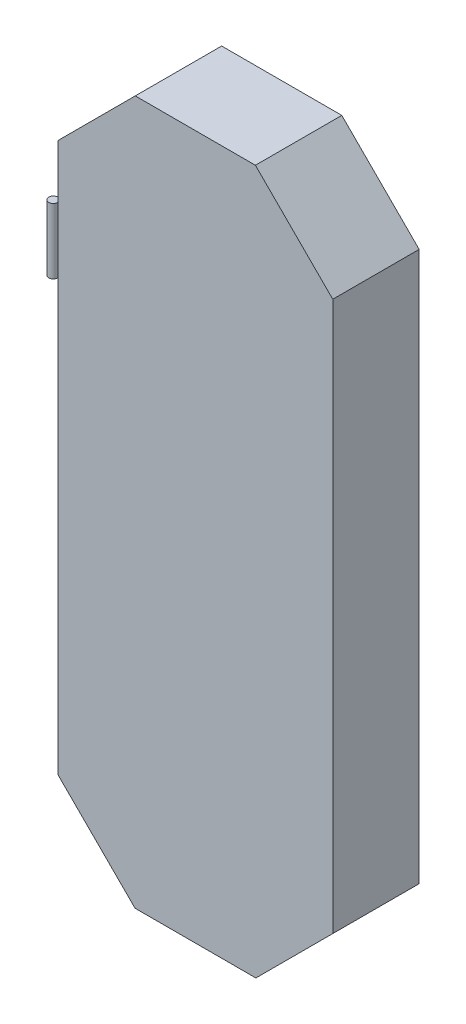
ISO-10303-21;
HEADER;
FILE_DESCRIPTION(('STEP AP214'),'2;1');
FILE_NAME('part.step','',(''),(''),'','','');
FILE_SCHEMA(('AUTOMOTIVE_DESIGN { 1 0 10303 214 1 1 1 1 }'));
ENDSEC;
DATA;
#1=APPLICATION_CONTEXT('core data for automotive mechanical design processes');
#2=APPLICATION_PROTOCOL_DEFINITION('international standard','automotive_design',2000,#1);
#3=PRODUCT_CONTEXT('',#1,'mechanical');
#4=PRODUCT('Part','Part','',(#3));
#5=PRODUCT_RELATED_PRODUCT_CATEGORY('part','',(#4));
#6=PRODUCT_DEFINITION_FORMATION('','',#4);
#7=PRODUCT_DEFINITION_CONTEXT('part definition',#1,'design');
#8=PRODUCT_DEFINITION('design','',#6,#7);
#9=PRODUCT_DEFINITION_SHAPE('','',#8);
#10=(LENGTH_UNIT() NAMED_UNIT(*) SI_UNIT(.MILLI.,.METRE.));
#11=(NAMED_UNIT(*) PLANE_ANGLE_UNIT() SI_UNIT($,.RADIAN.));
#12=(NAMED_UNIT(*) SI_UNIT($,.STERADIAN.) SOLID_ANGLE_UNIT());
#13=UNCERTAINTY_MEASURE_WITH_UNIT(LENGTH_MEASURE(1.E-05),#10,'distance_accuracy_value','');
#14=(GEOMETRIC_REPRESENTATION_CONTEXT(3) GLOBAL_UNCERTAINTY_ASSIGNED_CONTEXT((#13)) GLOBAL_UNIT_ASSIGNED_CONTEXT((#10,
#11,#12)) REPRESENTATION_CONTEXT('',''));
#15=CARTESIAN_POINT('',(0.,0.,0.));
#16=DIRECTION('',(0.,0.,1.));
#17=DIRECTION('',(1.,0.,0.));
#18=AXIS2_PLACEMENT_3D('',#15,#16,#17);
#19=CARTESIAN_POINT('',(-108.417078441272,540.825947063664,66.));
#20=DIRECTION('',(0.,-1.,0.));
#21=DIRECTION('',(1.,0.,0.));
#22=AXIS2_PLACEMENT_3D('',#19,#20,#21);
#23=CYLINDRICAL_SURFACE('',#22,3.50000000000001);
#24=CARTESIAN_POINT('',(-108.417078441272,540.825947063664,66.));
#25=DIRECTION('',(0.,1.,0.));
#26=DIRECTION('',(-1.,0.,0.));
#27=AXIS2_PLACEMENT_3D('',#24,#25,#26);
#28=CIRCLE('',#27,3.50000000000001);
#29=CARTESIAN_POINT('',(-111.917078441272,540.825947063664,66.));
#30=VERTEX_POINT('',#29);
#31=EDGE_CURVE('E11',#30,#30,#28,.T.);
#32=ORIENTED_EDGE('',*,*,#31,.F.);
#33=EDGE_LOOP('',(#32));
#34=FACE_BOUND('',#33,.T.);
#35=CARTESIAN_POINT('',(-108.417078441272,490.825947063664,66.));
#36=DIRECTION('',(0.,1.,0.));
#37=DIRECTION('',(-1.,0.,0.));
#38=AXIS2_PLACEMENT_3D('',#35,#36,#37);
#39=CIRCLE('',#38,3.50000000000001);
#40=CARTESIAN_POINT('',(-111.917078441272,490.825947063664,66.));
#41=VERTEX_POINT('',#40);
#42=EDGE_CURVE('E45',#41,#41,#39,.T.);
#43=ORIENTED_EDGE('',*,*,#42,.T.);
#44=EDGE_LOOP('',(#43));
#45=FACE_BOUND('',#44,.T.);
#46=ADVANCED_FACE('F42',(#34,#45),#23,.T.);
#47=CARTESIAN_POINT('',(-108.417078441272,540.825947063664,66.));
#48=DIRECTION('',(0.,1.,0.));
#49=DIRECTION('',(-1.,0.,0.));
#50=AXIS2_PLACEMENT_3D('',#47,#48,#49);
#51=PLANE('',#50);
#52=ORIENTED_EDGE('',*,*,#31,.T.);
#53=EDGE_LOOP('',(#52));
#54=FACE_BOUND('',#53,.T.);
#55=ADVANCED_FACE('F57',(#54),#51,.T.);
#56=CARTESIAN_POINT('',(-108.417078441272,490.825947063664,66.));
#57=DIRECTION('',(0.,1.,0.));
#58=DIRECTION('',(-1.,0.,0.));
#59=AXIS2_PLACEMENT_3D('',#56,#57,#58);
#60=PLANE('',#59);
#61=ORIENTED_EDGE('',*,*,#42,.F.);
#62=EDGE_LOOP('',(#61));
#63=FACE_BOUND('',#62,.T.);
#64=ADVANCED_FACE('F55',(#63),#60,.F.);
#65=CLOSED_SHELL('',(#46,#55,#64));
#66=MANIFOLD_SOLID_BREP('B2',#65);
#67=CARTESIAN_POINT('',(105.082921558728,640.825947063665,0.));
#68=DIRECTION('',(0.,0.,1.));
#69=DIRECTION('',(1.,0.,0.));
#70=AXIS2_PLACEMENT_3D('',#67,#68,#69);
#71=PLANE('',#70);
#72=DIRECTION('',(0.,1.,0.));
#73=VECTOR('',#72,1.);
#74=CARTESIAN_POINT('',(105.082921558728,162.025080800368,0.));
#75=LINE('',#74,#73);
#76=CARTESIAN_POINT('',(105.082921558728,162.025080800368,0.));
#77=VERTEX_POINT('',#76);
#78=CARTESIAN_POINT('',(105.082921558728,581.722068253563,0.));
#79=VERTEX_POINT('',#78);
#80=EDGE_CURVE('E180',#77,#79,#75,.T.);
#81=ORIENTED_EDGE('',*,*,#80,.F.);
#82=DIRECTION('',(0.707106781186547,0.707106781186548,0.));
#83=VECTOR('',#82,1.);
#84=CARTESIAN_POINT('',(46.326817336749,103.268976578389,0.));
#85=LINE('',#84,#83);
#86=CARTESIAN_POINT('',(46.326817336749,103.268976578389,0.));
#87=VERTEX_POINT('',#86);
#88=EDGE_CURVE('E134',#87,#77,#85,.T.);
#89=ORIENTED_EDGE('',*,*,#88,.F.);
#90=DIRECTION('',(1.,0.,0.));
#91=VECTOR('',#90,1.);
#92=CARTESIAN_POINT('',(-45.973174510304,103.268976578389,0.));
#93=LINE('',#92,#91);
#94=CARTESIAN_POINT('',(-45.973174510304,103.268976578389,0.));
#95=VERTEX_POINT('',#94);
#96=EDGE_CURVE('E128',#95,#87,#93,.T.);
#97=ORIENTED_EDGE('',*,*,#96,.F.);
#98=DIRECTION('',(0.707106781186547,-0.707106781186547,0.));
#99=VECTOR('',#98,1.);
#100=CARTESIAN_POINT('',(-104.917078441272,162.212880509357,0.));
#101=LINE('',#100,#99);
#102=CARTESIAN_POINT('',(-104.917078441272,162.212880509357,0.));
#103=VERTEX_POINT('',#102);
#104=EDGE_CURVE('E170',#103,#95,#101,.T.);
#105=ORIENTED_EDGE('',*,*,#104,.F.);
#106=DIRECTION('',(0.,-1.,0.));
#107=VECTOR('',#106,1.);
#108=CARTESIAN_POINT('',(-104.917078441272,581.722068253563,0.));
#109=LINE('',#108,#107);
#110=CARTESIAN_POINT('',(-104.917078441272,581.722068253563,0.));
#111=VERTEX_POINT('',#110);
#112=EDGE_CURVE('E190',#111,#103,#109,.T.);
#113=ORIENTED_EDGE('',*,*,#112,.F.);
#114=DIRECTION('',(-0.707106781186547,-0.707106781186548,0.));
#115=VECTOR('',#114,1.);
#116=CARTESIAN_POINT('',(-45.8131996311706,640.825947063664,0.));
#117=LINE('',#116,#115);
#118=CARTESIAN_POINT('',(-45.8131996311706,640.825947063664,0.));
#119=VERTEX_POINT('',#118);
#120=EDGE_CURVE('E188',#119,#111,#117,.T.);
#121=ORIENTED_EDGE('',*,*,#120,.F.);
#122=DIRECTION('',(-1.,0.,0.));
#123=VECTOR('',#122,1.);
#124=CARTESIAN_POINT('',(45.9790427486258,640.825947063665,0.));
#125=LINE('',#124,#123);
#126=CARTESIAN_POINT('',(45.9790427486258,640.825947063665,0.));
#127=VERTEX_POINT('',#126);
#128=EDGE_CURVE('E186',#127,#119,#125,.T.);
#129=ORIENTED_EDGE('',*,*,#128,.F.);
#130=DIRECTION('',(-0.707106781186547,0.707106781186548,0.));
#131=VECTOR('',#130,1.);
#132=CARTESIAN_POINT('',(105.082921558728,581.722068253563,0.));
#133=LINE('',#132,#131);
#134=EDGE_CURVE('E183',#79,#127,#133,.T.);
#135=ORIENTED_EDGE('',*,*,#134,.F.);
#136=EDGE_LOOP('',(#81,#89,#97,#105,#113,#121,#129,#135));
#137=FACE_BOUND('',#136,.T.);
#138=CARTESIAN_POINT('',(0.0829215587276402,539.825947063665,0.));
#139=DIRECTION('',(0.,0.,1.));
#140=DIRECTION('',(1.,0.,0.));
#141=AXIS2_PLACEMENT_3D('',#138,#139,#140);
#142=CIRCLE('',#141,42.);
#143=CARTESIAN_POINT('',(42.0829215587277,539.825947063665,0.));
#144=VERTEX_POINT('',#143);
#145=EDGE_CURVE('E40',#144,#144,#142,.F.);
#146=ORIENTED_EDGE('',*,*,#145,.F.);
#147=EDGE_LOOP('',(#146));
#148=FACE_BOUND('',#147,.T.);
#149=ADVANCED_FACE('F82',(#137,#148),#71,.F.);
#150=CARTESIAN_POINT('',(105.082921558728,162.025080800368,66.));
#151=DIRECTION('',(-1.,0.,0.));
#152=DIRECTION('',(0.,-1.,0.));
#153=AXIS2_PLACEMENT_3D('',#150,#151,#152);
#154=PLANE('',#153);
#155=ORIENTED_EDGE('',*,*,#80,.T.);
#156=DIRECTION('',(0.,0.,-1.));
#157=VECTOR('',#156,1.);
#158=CARTESIAN_POINT('',(105.082921558728,581.722068253563,66.));
#159=LINE('',#158,#157);
#160=CARTESIAN_POINT('',(105.082921558728,581.722068253563,66.));
#161=VERTEX_POINT('',#160);
#162=EDGE_CURVE('E91',#161,#79,#159,.T.);
#163=ORIENTED_EDGE('',*,*,#162,.F.);
#164=DIRECTION('',(0.,1.,0.));
#165=VECTOR('',#164,1.);
#166=CARTESIAN_POINT('',(105.082921558728,162.025080800368,66.));
#167=LINE('',#166,#165);
#168=CARTESIAN_POINT('',(105.082921558728,162.025080800368,66.));
#169=VERTEX_POINT('',#168);
#170=EDGE_CURVE('E195',#169,#161,#167,.T.);
#171=ORIENTED_EDGE('',*,*,#170,.F.);
#172=DIRECTION('',(0.,0.,-1.));
#173=VECTOR('',#172,1.);
#174=CARTESIAN_POINT('',(105.082921558728,162.025080800368,66.));
#175=LINE('',#174,#173);
#176=EDGE_CURVE('E176',#169,#77,#175,.T.);
#177=ORIENTED_EDGE('',*,*,#176,.T.);
#178=EDGE_LOOP('',(#155,#163,#171,#177));
#179=FACE_BOUND('',#178,.T.);
#180=ADVANCED_FACE('F84',(#179),#154,.F.);
#181=CARTESIAN_POINT('',(105.082921558728,581.722068253563,66.));
#182=DIRECTION('',(-0.707106781186548,-0.707106781186547,0.));
#183=DIRECTION('',(0.707106781186547,-0.707106781186548,0.));
#184=AXIS2_PLACEMENT_3D('',#181,#182,#183);
#185=PLANE('',#184);
#186=ORIENTED_EDGE('',*,*,#134,.T.);
#187=DIRECTION('',(0.,0.,-1.));
#188=VECTOR('',#187,1.);
#189=CARTESIAN_POINT('',(45.9790427486258,640.825947063665,66.));
#190=LINE('',#189,#188);
#191=CARTESIAN_POINT('',(45.9790427486258,640.825947063665,66.));
#192=VERTEX_POINT('',#191);
#193=EDGE_CURVE('E205',#192,#127,#190,.T.);
#194=ORIENTED_EDGE('',*,*,#193,.F.);
#195=DIRECTION('',(-0.707106781186547,0.707106781186548,0.));
#196=VECTOR('',#195,1.);
#197=CARTESIAN_POINT('',(105.082921558728,581.722068253563,66.));
#198=LINE('',#197,#196);
#199=EDGE_CURVE('E143',#161,#192,#198,.T.);
#200=ORIENTED_EDGE('',*,*,#199,.F.);
#201=ORIENTED_EDGE('',*,*,#162,.T.);
#202=EDGE_LOOP('',(#186,#194,#200,#201));
#203=FACE_BOUND('',#202,.T.);
#204=ADVANCED_FACE('F208',(#203),#185,.F.);
#205=CARTESIAN_POINT('',(45.9790427486258,640.825947063665,66.));
#206=DIRECTION('',(0.,-1.,0.));
#207=DIRECTION('',(1.,0.,0.));
#208=AXIS2_PLACEMENT_3D('',#205,#206,#207);
#209=PLANE('',#208);
#210=ORIENTED_EDGE('',*,*,#128,.T.);
#211=DIRECTION('',(0.,0.,-1.));
#212=VECTOR('',#211,1.);
#213=CARTESIAN_POINT('',(-45.8131996311706,640.825947063664,66.));
#214=LINE('',#213,#212);
#215=CARTESIAN_POINT('',(-45.8131996311706,640.825947063664,66.));
#216=VERTEX_POINT('',#215);
#217=EDGE_CURVE('E202',#216,#119,#214,.T.);
#218=ORIENTED_EDGE('',*,*,#217,.F.);
#219=DIRECTION('',(-1.,0.,0.));
#220=VECTOR('',#219,1.);
#221=CARTESIAN_POINT('',(45.9790427486258,640.825947063665,66.));
#222=LINE('',#221,#220);
#223=EDGE_CURVE('E226',#192,#216,#222,.T.);
#224=ORIENTED_EDGE('',*,*,#223,.F.);
#225=ORIENTED_EDGE('',*,*,#193,.T.);
#226=EDGE_LOOP('',(#210,#218,#224,#225));
#227=FACE_BOUND('',#226,.T.);
#228=ADVANCED_FACE('F219',(#227),#209,.F.);
#229=CARTESIAN_POINT('',(-45.8131996311706,640.825947063664,66.));
#230=DIRECTION('',(0.707106781186548,-0.707106781186547,0.));
#231=DIRECTION('',(0.707106781186547,0.707106781186548,0.));
#232=AXIS2_PLACEMENT_3D('',#229,#230,#231);
#233=PLANE('',#232);
#234=ORIENTED_EDGE('',*,*,#120,.T.);
#235=DIRECTION('',(0.,0.,-1.));
#236=VECTOR('',#235,1.);
#237=CARTESIAN_POINT('',(-104.917078441272,581.722068253563,66.));
#238=LINE('',#237,#236);
#239=CARTESIAN_POINT('',(-104.917078441272,581.722068253563,66.));
#240=VERTEX_POINT('',#239);
#241=EDGE_CURVE('E199',#240,#111,#238,.T.);
#242=ORIENTED_EDGE('',*,*,#241,.F.);
#243=DIRECTION('',(-0.707106781186547,-0.707106781186548,0.));
#244=VECTOR('',#243,1.);
#245=CARTESIAN_POINT('',(-45.8131996311706,640.825947063664,66.));
#246=LINE('',#245,#244);
#247=EDGE_CURVE('E225',#216,#240,#246,.T.);
#248=ORIENTED_EDGE('',*,*,#247,.F.);
#249=ORIENTED_EDGE('',*,*,#217,.T.);
#250=EDGE_LOOP('',(#234,#242,#248,#249));
#251=FACE_BOUND('',#250,.T.);
#252=ADVANCED_FACE('F223',(#251),#233,.F.);
#253=CARTESIAN_POINT('',(-104.917078441272,581.722068253563,66.));
#254=DIRECTION('',(1.,0.,0.));
#255=DIRECTION('',(0.,1.,0.));
#256=AXIS2_PLACEMENT_3D('',#253,#254,#255);
#257=PLANE('',#256);
#258=ORIENTED_EDGE('',*,*,#112,.T.);
#259=DIRECTION('',(0.,0.,-1.));
#260=VECTOR('',#259,1.);
#261=CARTESIAN_POINT('',(-104.917078441272,162.212880509357,66.));
#262=LINE('',#261,#260);
#263=CARTESIAN_POINT('',(-104.917078441272,162.212880509357,66.));
#264=VERTEX_POINT('',#263);
#265=EDGE_CURVE('E171',#264,#103,#262,.T.);
#266=ORIENTED_EDGE('',*,*,#265,.F.);
#267=DIRECTION('',(0.,-1.,0.));
#268=VECTOR('',#267,1.);
#269=CARTESIAN_POINT('',(-104.917078441272,581.722068253563,66.));
#270=LINE('',#269,#268);
#271=EDGE_CURVE('E162',#240,#264,#270,.T.);
#272=ORIENTED_EDGE('',*,*,#271,.F.);
#273=ORIENTED_EDGE('',*,*,#241,.T.);
#274=EDGE_LOOP('',(#258,#266,#272,#273));
#275=FACE_BOUND('',#274,.T.);
#276=ADVANCED_FACE('F274',(#275),#257,.F.);
#277=CARTESIAN_POINT('',(-104.917078441272,162.212880509357,66.));
#278=DIRECTION('',(0.707106781186547,0.707106781186547,0.));
#279=DIRECTION('',(-0.707106781186548,0.707106781186548,0.));
#280=AXIS2_PLACEMENT_3D('',#277,#278,#279);
#281=PLANE('',#280);
#282=ORIENTED_EDGE('',*,*,#104,.T.);
#283=DIRECTION('',(0.,0.,-1.));
#284=VECTOR('',#283,1.);
#285=CARTESIAN_POINT('',(-45.973174510304,103.268976578389,66.));
#286=LINE('',#285,#284);
#287=CARTESIAN_POINT('',(-45.973174510304,103.268976578389,66.));
#288=VERTEX_POINT('',#287);
#289=EDGE_CURVE('E167',#288,#95,#286,.T.);
#290=ORIENTED_EDGE('',*,*,#289,.F.);
#291=DIRECTION('',(0.707106781186547,-0.707106781186547,0.));
#292=VECTOR('',#291,1.);
#293=CARTESIAN_POINT('',(-104.917078441272,162.212880509357,66.));
#294=LINE('',#293,#292);
#295=EDGE_CURVE('E156',#264,#288,#294,.T.);
#296=ORIENTED_EDGE('',*,*,#295,.F.);
#297=ORIENTED_EDGE('',*,*,#265,.T.);
#298=EDGE_LOOP('',(#282,#290,#296,#297));
#299=FACE_BOUND('',#298,.T.);
#300=ADVANCED_FACE('F168',(#299),#281,.F.);
#301=CARTESIAN_POINT('',(-45.973174510304,103.268976578389,66.));
#302=DIRECTION('',(0.,1.,0.));
#303=DIRECTION('',(0.,0.,1.));
#304=AXIS2_PLACEMENT_3D('',#301,#302,#303);
#305=PLANE('',#304);
#306=ORIENTED_EDGE('',*,*,#96,.T.);
#307=DIRECTION('',(0.,0.,-1.));
#308=VECTOR('',#307,1.);
#309=CARTESIAN_POINT('',(46.326817336749,103.268976578389,66.));
#310=LINE('',#309,#308);
#311=CARTESIAN_POINT('',(46.326817336749,103.268976578389,66.));
#312=VERTEX_POINT('',#311);
#313=EDGE_CURVE('E172',#312,#87,#310,.T.);
#314=ORIENTED_EDGE('',*,*,#313,.F.);
#315=DIRECTION('',(1.,0.,0.));
#316=VECTOR('',#315,1.);
#317=CARTESIAN_POINT('',(-45.973174510304,103.268976578389,66.));
#318=LINE('',#317,#316);
#319=EDGE_CURVE('E160',#288,#312,#318,.T.);
#320=ORIENTED_EDGE('',*,*,#319,.F.);
#321=ORIENTED_EDGE('',*,*,#289,.T.);
#322=EDGE_LOOP('',(#306,#314,#320,#321));
#323=FACE_BOUND('',#322,.T.);
#324=ADVANCED_FACE('F174',(#323),#305,.F.);
#325=CARTESIAN_POINT('',(46.326817336749,103.268976578389,66.));
#326=DIRECTION('',(-0.707106781186548,0.707106781186547,0.));
#327=DIRECTION('',(-0.707106781186547,-0.707106781186548,0.));
#328=AXIS2_PLACEMENT_3D('',#325,#326,#327);
#329=PLANE('',#328);
#330=ORIENTED_EDGE('',*,*,#88,.T.);
#331=ORIENTED_EDGE('',*,*,#176,.F.);
#332=DIRECTION('',(0.707106781186547,0.707106781186548,0.));
#333=VECTOR('',#332,1.);
#334=CARTESIAN_POINT('',(46.326817336749,103.268976578389,66.));
#335=LINE('',#334,#333);
#336=EDGE_CURVE('E99',#312,#169,#335,.T.);
#337=ORIENTED_EDGE('',*,*,#336,.F.);
#338=ORIENTED_EDGE('',*,*,#313,.T.);
#339=EDGE_LOOP('',(#330,#331,#337,#338));
#340=FACE_BOUND('',#339,.T.);
#341=ADVANCED_FACE('F267',(#340),#329,.F.);
#342=CARTESIAN_POINT('',(105.082921558728,640.825947063665,66.));
#343=DIRECTION('',(0.,0.,1.));
#344=DIRECTION('',(1.,0.,0.));
#345=AXIS2_PLACEMENT_3D('',#342,#343,#344);
#346=PLANE('',#345);
#347=ORIENTED_EDGE('',*,*,#170,.T.);
#348=ORIENTED_EDGE('',*,*,#199,.T.);
#349=ORIENTED_EDGE('',*,*,#223,.T.);
#350=ORIENTED_EDGE('',*,*,#247,.T.);
#351=ORIENTED_EDGE('',*,*,#271,.T.);
#352=ORIENTED_EDGE('',*,*,#295,.T.);
#353=ORIENTED_EDGE('',*,*,#319,.T.);
#354=ORIENTED_EDGE('',*,*,#336,.T.);
#355=EDGE_LOOP('',(#347,#348,#349,#350,#351,#352,#353,#354));
#356=FACE_BOUND('',#355,.T.);
#357=ADVANCED_FACE('F158',(#356),#346,.T.);
#358=CARTESIAN_POINT('',(0.0829215587276402,539.825947063665,-21.));
#359=DIRECTION('',(0.,0.,1.));
#360=DIRECTION('',(1.,0.,0.));
#361=AXIS2_PLACEMENT_3D('',#358,#359,#360);
#362=CYLINDRICAL_SURFACE('',#361,42.);
#363=CARTESIAN_POINT('',(0.0829215587276402,539.825947063665,-21.));
#364=DIRECTION('',(0.,0.,-1.));
#365=DIRECTION('',(-1.,0.,0.));
#366=AXIS2_PLACEMENT_3D('',#363,#364,#365);
#367=CIRCLE('',#366,42.);
#368=CARTESIAN_POINT('',(42.0829215587277,539.825947063665,-21.));
#369=VERTEX_POINT('',#368);
#370=EDGE_CURVE('E184',#369,#369,#367,.T.);
#371=CARTESIAN_POINT('',(42.0829215587277,539.825947063665,-21.));
#372=CARTESIAN_POINT('',(42.0829215587277,539.825947063665,-20.78125));
#373=CARTESIAN_POINT('',(42.0829215587277,539.825947063665,-20.5625));
#374=CARTESIAN_POINT('',(42.0829215587277,539.825947063665,-20.125));
#375=CARTESIAN_POINT('',(42.0829215587277,539.825947063665,-19.90625));
#376=CARTESIAN_POINT('',(42.0829215587277,539.825947063665,-19.46875));
#377=CARTESIAN_POINT('',(42.0829215587277,539.825947063665,-19.25));
#378=CARTESIAN_POINT('',(42.0829215587277,539.825947063665,-18.8125));
#379=CARTESIAN_POINT('',(42.0829215587277,539.825947063665,-18.59375));
#380=CARTESIAN_POINT('',(42.0829215587277,539.825947063665,-18.15625));
#381=CARTESIAN_POINT('',(42.0829215587277,539.825947063665,-17.9375));
#382=CARTESIAN_POINT('',(42.0829215587277,539.825947063665,-17.5));
#383=CARTESIAN_POINT('',(42.0829215587277,539.825947063665,-17.28125));
#384=CARTESIAN_POINT('',(42.0829215587277,539.825947063665,-16.84375));
#385=CARTESIAN_POINT('',(42.0829215587277,539.825947063665,-16.625));
#386=CARTESIAN_POINT('',(42.0829215587277,539.825947063665,-16.1875));
#387=CARTESIAN_POINT('',(42.0829215587277,539.825947063665,-15.96875));
#388=CARTESIAN_POINT('',(42.0829215587277,539.825947063665,-15.53125));
#389=CARTESIAN_POINT('',(42.0829215587277,539.825947063665,-15.3125));
#390=CARTESIAN_POINT('',(42.0829215587277,539.825947063665,-14.875));
#391=CARTESIAN_POINT('',(42.0829215587277,539.825947063665,-14.65625));
#392=CARTESIAN_POINT('',(42.0829215587277,539.825947063665,-14.21875));
#393=CARTESIAN_POINT('',(42.0829215587277,539.825947063665,-14.));
#394=CARTESIAN_POINT('',(42.0829215587277,539.825947063665,-13.5625));
#395=CARTESIAN_POINT('',(42.0829215587277,539.825947063665,-13.34375));
#396=CARTESIAN_POINT('',(42.0829215587277,539.825947063665,-12.90625));
#397=CARTESIAN_POINT('',(42.0829215587277,539.825947063665,-12.6875));
#398=CARTESIAN_POINT('',(42.0829215587277,539.825947063665,-12.25));
#399=CARTESIAN_POINT('',(42.0829215587277,539.825947063665,-12.03125));
#400=CARTESIAN_POINT('',(42.0829215587277,539.825947063665,-11.59375));
#401=CARTESIAN_POINT('',(42.0829215587277,539.825947063665,-11.375));
#402=CARTESIAN_POINT('',(42.0829215587277,539.825947063665,-10.9375));
#403=CARTESIAN_POINT('',(42.0829215587277,539.825947063665,-10.71875));
#404=CARTESIAN_POINT('',(42.0829215587277,539.825947063665,-10.28125));
#405=CARTESIAN_POINT('',(42.0829215587277,539.825947063665,-10.0625));
#406=CARTESIAN_POINT('',(42.0829215587277,539.825947063665,-9.625));
#407=CARTESIAN_POINT('',(42.0829215587277,539.825947063665,-9.40625));
#408=CARTESIAN_POINT('',(42.0829215587277,539.825947063665,-8.96875));
#409=CARTESIAN_POINT('',(42.0829215587277,539.825947063665,-8.75));
#410=CARTESIAN_POINT('',(42.0829215587277,539.825947063665,-8.3125));
#411=CARTESIAN_POINT('',(42.0829215587277,539.825947063665,-8.09375));
#412=CARTESIAN_POINT('',(42.0829215587277,539.825947063665,-7.65625));
#413=CARTESIAN_POINT('',(42.0829215587277,539.825947063665,-7.4375));
#414=CARTESIAN_POINT('',(42.0829215587277,539.825947063665,-7.));
#415=CARTESIAN_POINT('',(42.0829215587277,539.825947063665,-6.78125));
#416=CARTESIAN_POINT('',(42.0829215587277,539.825947063665,-6.34375));
#417=CARTESIAN_POINT('',(42.0829215587277,539.825947063665,-6.125));
#418=CARTESIAN_POINT('',(42.0829215587277,539.825947063665,-5.6875));
#419=CARTESIAN_POINT('',(42.0829215587277,539.825947063665,-5.46875));
#420=CARTESIAN_POINT('',(42.0829215587277,539.825947063665,-5.03125));
#421=CARTESIAN_POINT('',(42.0829215587277,539.825947063665,-4.8125));
#422=CARTESIAN_POINT('',(42.0829215587277,539.825947063665,-4.375));
#423=CARTESIAN_POINT('',(42.0829215587277,539.825947063665,-4.15625));
#424=CARTESIAN_POINT('',(42.0829215587277,539.825947063665,-3.71875));
#425=CARTESIAN_POINT('',(42.0829215587277,539.825947063665,-3.5));
#426=CARTESIAN_POINT('',(42.0829215587277,539.825947063665,-3.0625));
#427=CARTESIAN_POINT('',(42.0829215587277,539.825947063665,-2.84375));
#428=CARTESIAN_POINT('',(42.0829215587277,539.825947063665,-2.40625));
#429=CARTESIAN_POINT('',(42.0829215587277,539.825947063665,-2.1875));
#430=CARTESIAN_POINT('',(42.0829215587277,539.825947063665,-1.75));
#431=CARTESIAN_POINT('',(42.0829215587277,539.825947063665,-1.53125));
#432=CARTESIAN_POINT('',(42.0829215587277,539.825947063665,-1.09375));
#433=CARTESIAN_POINT('',(42.0829215587277,539.825947063665,-0.875000000000001));
#434=CARTESIAN_POINT('',(42.0829215587277,539.825947063665,-0.4375));
#435=CARTESIAN_POINT('',(42.0829215587277,539.825947063665,-0.21875));
#436=CARTESIAN_POINT('',(42.0829215587277,539.825947063665,0.));
#437=B_SPLINE_CURVE_WITH_KNOTS('',3,(#371,#372,#373,#374,#375,#376,#377,#378,#379,#380,#381,
#382,#383,#384,#385,#386,#387,#388,#389,#390,#391,#392,#393,#394,#395,#396,#397,#398,#399,#400,
#401,#402,#403,#404,#405,#406,#407,#408,#409,#410,#411,#412,#413,#414,#415,#416,#417,#418,#419,
#420,#421,#422,#423,#424,#425,#426,#427,#428,#429,#430,#431,#432,#433,#434,#435,#436),
.UNSPECIFIED.,.F.,.F.,(4,2,2,2,2,2,2,2,2,2,2,2,2,2,2,2,2,2,2,2,2,2,2,2,2,2,2,2,2,2,2,2,4),(0.,
0.656250000000001,1.3125,1.96875,2.625,3.28125,3.9375,4.59375,5.25,5.90625,6.5625,7.21875,7.875,
8.53125,9.1875,9.84375,10.5,11.15625,11.8125,12.46875,13.125,13.78125,14.4375,15.09375,15.75,
16.40625,17.0625,17.71875,18.375,19.03125,19.6875,20.34375,21.),.UNSPECIFIED.);
#438=EDGE_CURVE('BSEAM252',#369,#144,#437,.T.);
#439=ORIENTED_EDGE('',*,*,#370,.F.);
#440=ORIENTED_EDGE('',*,*,#145,.T.);
#441=ORIENTED_EDGE('',*,*,#438,.T.);
#442=ORIENTED_EDGE('',*,*,#438,.F.);
#443=EDGE_LOOP('',(#439,#441,#440,#442));
#444=FACE_BOUND('',#443,.T.);
#445=ADVANCED_FACE('F252',(#444),#362,.T.);
#446=CARTESIAN_POINT('',(0.0829215587276402,539.825947063665,-21.));
#447=DIRECTION('',(0.,0.,-1.));
#448=DIRECTION('',(-1.,0.,0.));
#449=AXIS2_PLACEMENT_3D('',#446,#447,#448);
#450=PLANE('',#449);
#451=CARTESIAN_POINT('',(0.0829215587276402,539.825947063665,-21.));
#452=DIRECTION('',(0.,0.,-1.));
#453=DIRECTION('',(-1.,0.,0.));
#454=AXIS2_PLACEMENT_3D('',#451,#452,#453);
#455=CIRCLE('',#454,15.);
#456=CARTESIAN_POINT('',(-14.9170784412724,539.825947063665,-21.));
#457=VERTEX_POINT('',#456);
#458=EDGE_CURVE('E235',#457,#457,#455,.T.);
#459=ORIENTED_EDGE('',*,*,#458,.F.);
#460=EDGE_LOOP('',(#459));
#461=FACE_BOUND('',#460,.T.);
#462=ORIENTED_EDGE('',*,*,#370,.T.);
#463=EDGE_LOOP('',(#462));
#464=FACE_BOUND('',#463,.T.);
#465=ADVANCED_FACE('F246',(#461,#464),#450,.T.);
#466=CARTESIAN_POINT('',(0.0829215587276402,539.825947063665,-1.));
#467=DIRECTION('',(0.,0.,-1.));
#468=DIRECTION('',(-1.,0.,0.));
#469=AXIS2_PLACEMENT_3D('',#466,#467,#468);
#470=CYLINDRICAL_SURFACE('',#469,15.);
#471=CARTESIAN_POINT('',(0.0829215587276402,539.825947063665,-1.));
#472=DIRECTION('',(0.,0.,-1.));
#473=DIRECTION('',(-1.,0.,0.));
#474=AXIS2_PLACEMENT_3D('',#471,#472,#473);
#475=CIRCLE('',#474,15.);
#476=CARTESIAN_POINT('',(-14.9170784412724,539.825947063665,-1.));
#477=VERTEX_POINT('',#476);
#478=EDGE_CURVE('E234',#477,#477,#475,.T.);
#479=ORIENTED_EDGE('',*,*,#478,.F.);
#480=EDGE_LOOP('',(#479));
#481=FACE_BOUND('',#480,.T.);
#482=ORIENTED_EDGE('',*,*,#458,.T.);
#483=EDGE_LOOP('',(#482));
#484=FACE_BOUND('',#483,.T.);
#485=ADVANCED_FACE('F243',(#481,#484),#470,.F.);
#486=CARTESIAN_POINT('',(0.0829215587276402,539.825947063665,-1.));
#487=DIRECTION('',(0.,0.,-1.));
#488=DIRECTION('',(-1.,0.,0.));
#489=AXIS2_PLACEMENT_3D('',#486,#487,#488);
#490=PLANE('',#489);
#491=ORIENTED_EDGE('',*,*,#478,.T.);
#492=EDGE_LOOP('',(#491));
#493=FACE_BOUND('',#492,.T.);
#494=ADVANCED_FACE('F241',(#493),#490,.T.);
#495=CLOSED_SHELL('',(#149,#180,#204,#228,#252,#276,#300,#324,#341,#357,#445,#465,#485,#494));
#496=MANIFOLD_SOLID_BREP('B6',#495);
#497=ADVANCED_BREP_SHAPE_REPRESENTATION('',(#18,#66,#496),#14);
#498=SHAPE_DEFINITION_REPRESENTATION(#9,#497);
ENDSEC;
END-ISO-10303-21;
